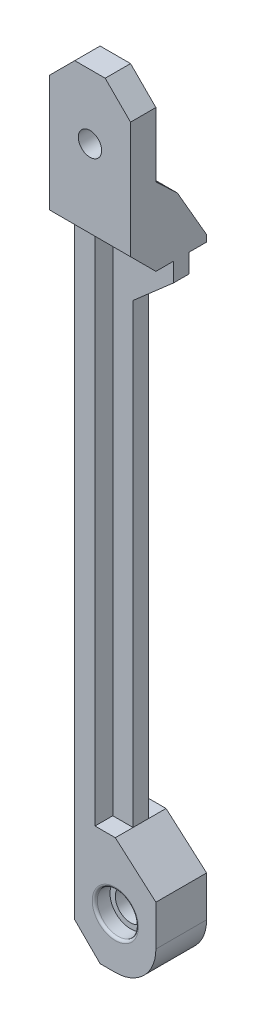
ISO-10303-21;
HEADER;
FILE_DESCRIPTION(('STEP AP214'),'2;1');
FILE_NAME('part.step','',(''),(''),'','','');
FILE_SCHEMA(('AUTOMOTIVE_DESIGN { 1 0 10303 214 1 1 1 1 }'));
ENDSEC;
DATA;
#1=APPLICATION_CONTEXT('core data for automotive mechanical design processes');
#2=APPLICATION_PROTOCOL_DEFINITION('international standard','automotive_design',2000,#1);
#3=PRODUCT_CONTEXT('',#1,'mechanical');
#4=PRODUCT('Part','Part','',(#3));
#5=PRODUCT_RELATED_PRODUCT_CATEGORY('part','',(#4));
#6=PRODUCT_DEFINITION_FORMATION('','',#4);
#7=PRODUCT_DEFINITION_CONTEXT('part definition',#1,'design');
#8=PRODUCT_DEFINITION('design','',#6,#7);
#9=PRODUCT_DEFINITION_SHAPE('','',#8);
#10=(LENGTH_UNIT() NAMED_UNIT(*) SI_UNIT(.MILLI.,.METRE.));
#11=(NAMED_UNIT(*) PLANE_ANGLE_UNIT() SI_UNIT($,.RADIAN.));
#12=(NAMED_UNIT(*) SI_UNIT($,.STERADIAN.) SOLID_ANGLE_UNIT());
#13=UNCERTAINTY_MEASURE_WITH_UNIT(LENGTH_MEASURE(1.E-05),#10,'distance_accuracy_value','');
#14=(GEOMETRIC_REPRESENTATION_CONTEXT(3) GLOBAL_UNCERTAINTY_ASSIGNED_CONTEXT((#13)) GLOBAL_UNIT_ASSIGNED_CONTEXT((#10,
#11,#12)) REPRESENTATION_CONTEXT('',''));
#15=CARTESIAN_POINT('',(0.,0.,0.));
#16=DIRECTION('',(0.,0.,1.));
#17=DIRECTION('',(1.,0.,0.));
#18=AXIS2_PLACEMENT_3D('',#15,#16,#17);
#19=CARTESIAN_POINT('',(0.,-67.5,10.));
#20=DIRECTION('',(0.,0.,-1.));
#21=DIRECTION('',(-1.,0.,0.));
#22=AXIS2_PLACEMENT_3D('',#19,#20,#21);
#23=CYLINDRICAL_SURFACE('',#22,4.05);
#24=CARTESIAN_POINT('',(0.,-67.5,0.5));
#25=DIRECTION('',(0.,0.,1.));
#26=DIRECTION('',(1.,0.,0.));
#27=AXIS2_PLACEMENT_3D('',#24,#25,#26);
#28=CIRCLE('',#27,4.05);
#29=CARTESIAN_POINT('',(4.05000000000002,-67.5,0.5));
#30=VERTEX_POINT('',#29);
#31=EDGE_CURVE('E11',#30,#30,#28,.F.);
#32=ORIENTED_EDGE('',*,*,#31,.T.);
#33=EDGE_LOOP('',(#32));
#34=FACE_BOUND('',#33,.T.);
#35=CARTESIAN_POINT('',(0.,-67.5,3.));
#36=DIRECTION('',(0.,0.,1.));
#37=DIRECTION('',(1.,0.,0.));
#38=AXIS2_PLACEMENT_3D('',#35,#36,#37);
#39=CIRCLE('',#38,4.05);
#40=CARTESIAN_POINT('',(4.05000000000002,-67.5,3.));
#41=VERTEX_POINT('',#40);
#42=EDGE_CURVE('E250',#41,#41,#39,.T.);
#43=ORIENTED_EDGE('',*,*,#42,.T.);
#44=EDGE_LOOP('',(#43));
#45=FACE_BOUND('',#44,.T.);
#46=ADVANCED_FACE('F37',(#34,#45),#23,.F.);
#47=CARTESIAN_POINT('',(0.,0.,10.));
#48=DIRECTION('',(0.,0.,1.));
#49=DIRECTION('',(1.,0.,0.));
#50=AXIS2_PLACEMENT_3D('',#47,#48,#49);
#51=PLANE('',#50);
#52=CARTESIAN_POINT('',(0.,-67.5,10.));
#53=DIRECTION('',(0.,0.,1.));
#54=DIRECTION('',(1.,0.,0.));
#55=AXIS2_PLACEMENT_3D('',#52,#53,#54);
#56=CIRCLE('',#55,4.55);
#57=CARTESIAN_POINT('',(4.55000000000002,-67.5,10.));
#58=VERTEX_POINT('',#57);
#59=EDGE_CURVE('E432',#58,#58,#56,.F.);
#60=ORIENTED_EDGE('',*,*,#59,.T.);
#61=EDGE_LOOP('',(#60));
#62=FACE_BOUND('',#61,.T.);
#63=DIRECTION('',(-0.752104997827,0.659043300734974,0.));
#64=VECTOR('',#63,1.);
#65=CARTESIAN_POINT('',(8.00000000000002,-61.5,10.));
#66=LINE('',#65,#64);
#67=CARTESIAN_POINT('',(8.00000000000002,-61.5,10.));
#68=VERTEX_POINT('',#67);
#69=CARTESIAN_POINT('',(0.,-54.4898798424252,10.));
#70=VERTEX_POINT('',#69);
#71=EDGE_CURVE('E338',#68,#70,#66,.T.);
#72=ORIENTED_EDGE('',*,*,#71,.T.);
#73=DIRECTION('',(-1.,0.,0.));
#74=VECTOR('',#73,1.);
#75=CARTESIAN_POINT('',(20.,-54.4898798424252,10.));
#76=LINE('',#75,#74);
#77=CARTESIAN_POINT('',(-3.99999999999999,-54.4898798424252,10.));
#78=VERTEX_POINT('',#77);
#79=EDGE_CURVE('E232',#70,#78,#76,.T.);
#80=ORIENTED_EDGE('',*,*,#79,.T.);
#81=DIRECTION('',(0.,-1.,0.));
#82=VECTOR('',#81,1.);
#83=CARTESIAN_POINT('',(-4.00000000000001,46.2196868799931,10.));
#84=LINE('',#83,#82);
#85=CARTESIAN_POINT('',(-4.00000000000001,46.2196868799931,10.));
#86=VERTEX_POINT('',#85);
#87=EDGE_CURVE('E246',#86,#78,#84,.T.);
#88=ORIENTED_EDGE('',*,*,#87,.F.);
#89=DIRECTION('',(-1.,0.,0.));
#90=VECTOR('',#89,1.);
#91=CARTESIAN_POINT('',(0.,46.2196868799931,10.));
#92=LINE('',#91,#90);
#93=CARTESIAN_POINT('',(-7.99999999999998,46.2196868799931,10.));
#94=VERTEX_POINT('',#93);
#95=EDGE_CURVE('E366',#86,#94,#92,.T.);
#96=ORIENTED_EDGE('',*,*,#95,.T.);
#97=DIRECTION('',(0.,-1.,0.));
#98=VECTOR('',#97,1.);
#99=CARTESIAN_POINT('',(-7.99999999999998,42.5,10.));
#100=LINE('',#99,#98);
#101=CARTESIAN_POINT('',(-7.99999999999998,-72.4999999999999,10.));
#102=VERTEX_POINT('',#101);
#103=EDGE_CURVE('E330',#94,#102,#100,.T.);
#104=ORIENTED_EDGE('',*,*,#103,.T.);
#105=DIRECTION('',(-0.707106781186547,0.707106781186549,0.));
#106=VECTOR('',#105,1.);
#107=CARTESIAN_POINT('',(-40.25,-40.2499999999999,10.));
#108=LINE('',#107,#106);
#109=CARTESIAN_POINT('',(-2.99999999999996,-77.5,10.));
#110=VERTEX_POINT('',#109);
#111=EDGE_CURVE('E410',#102,#110,#108,.F.);
#112=ORIENTED_EDGE('',*,*,#111,.T.);
#113=DIRECTION('',(1.,0.,0.));
#114=VECTOR('',#113,1.);
#115=CARTESIAN_POINT('',(-7.99999999999998,-77.5,10.));
#116=LINE('',#115,#114);
#117=CARTESIAN_POINT('',(0.,-77.5,10.));
#118=VERTEX_POINT('',#117);
#119=EDGE_CURVE('E333',#110,#118,#116,.T.);
#120=ORIENTED_EDGE('',*,*,#119,.T.);
#121=CARTESIAN_POINT('',(0.,-69.5,10.));
#122=DIRECTION('',(0.,0.,1.));
#123=DIRECTION('',(1.,0.,0.));
#124=AXIS2_PLACEMENT_3D('',#121,#122,#123);
#125=CIRCLE('',#124,8.);
#126=CARTESIAN_POINT('',(8.00000000000002,-69.5,10.));
#127=VERTEX_POINT('',#126);
#128=EDGE_CURVE('E418',#118,#127,#125,.T.);
#129=ORIENTED_EDGE('',*,*,#128,.T.);
#130=DIRECTION('',(0.,1.,0.));
#131=VECTOR('',#130,1.);
#132=CARTESIAN_POINT('',(8.00000000000002,-77.5,10.));
#133=LINE('',#132,#131);
#134=EDGE_CURVE('E336',#127,#68,#133,.T.);
#135=ORIENTED_EDGE('',*,*,#134,.T.);
#136=EDGE_LOOP('',(#72,#80,#88,#96,#104,#112,#120,#129,#135));
#137=FACE_BOUND('',#136,.T.);
#138=ADVANCED_FACE('F448',(#62,#137),#51,.T.);
#139=CARTESIAN_POINT('',(0.,0.,0.));
#140=DIRECTION('',(0.,0.,1.));
#141=DIRECTION('',(1.,0.,0.));
#142=AXIS2_PLACEMENT_3D('',#139,#140,#141);
#143=PLANE('',#142);
#144=CARTESIAN_POINT('',(0.,-67.5,0.));
#145=DIRECTION('',(0.,0.,1.));
#146=DIRECTION('',(1.,0.,0.));
#147=AXIS2_PLACEMENT_3D('',#144,#145,#146);
#148=CIRCLE('',#147,4.55);
#149=CARTESIAN_POINT('',(4.55000000000002,-67.5,0.));
#150=VERTEX_POINT('',#149);
#151=EDGE_CURVE('E45',#150,#150,#148,.T.);
#152=ORIENTED_EDGE('',*,*,#151,.T.);
#153=EDGE_LOOP('',(#152));
#154=FACE_BOUND('',#153,.T.);
#155=DIRECTION('',(-1.,0.,0.));
#156=VECTOR('',#155,1.);
#157=CARTESIAN_POINT('',(20.,46.2196868799931,0.));
#158=LINE('',#157,#156);
#159=CARTESIAN_POINT('',(7.99999999999999,46.2196868799931,0.));
#160=VERTEX_POINT('',#159);
#161=CARTESIAN_POINT('',(-4.00000000000001,46.2196868799931,0.));
#162=VERTEX_POINT('',#161);
#163=EDGE_CURVE('E218',#160,#162,#158,.T.);
#164=ORIENTED_EDGE('',*,*,#163,.T.);
#165=DIRECTION('',(0.,1.,0.));
#166=VECTOR('',#165,1.);
#167=CARTESIAN_POINT('',(-4.00000000000001,46.2196868799931,0.));
#168=LINE('',#167,#166);
#169=CARTESIAN_POINT('',(-3.99999999999999,-54.4898798424252,0.));
#170=VERTEX_POINT('',#169);
#171=EDGE_CURVE('E223',#170,#162,#168,.T.);
#172=ORIENTED_EDGE('',*,*,#171,.F.);
#173=DIRECTION('',(-1.,0.,0.));
#174=VECTOR('',#173,1.);
#175=CARTESIAN_POINT('',(20.,-54.4898798424252,0.));
#176=LINE('',#175,#174);
#177=CARTESIAN_POINT('',(0.,-54.4898798424252,0.));
#178=VERTEX_POINT('',#177);
#179=EDGE_CURVE('E493',#178,#170,#176,.T.);
#180=ORIENTED_EDGE('',*,*,#179,.F.);
#181=DIRECTION('',(-0.752104997827,0.659043300734974,0.));
#182=VECTOR('',#181,1.);
#183=CARTESIAN_POINT('',(8.00000000000002,-61.5,0.));
#184=LINE('',#183,#182);
#185=CARTESIAN_POINT('',(8.00000000000002,-61.5,0.));
#186=VERTEX_POINT('',#185);
#187=EDGE_CURVE('E348',#186,#178,#184,.T.);
#188=ORIENTED_EDGE('',*,*,#187,.F.);
#189=DIRECTION('',(0.,1.,0.));
#190=VECTOR('',#189,1.);
#191=CARTESIAN_POINT('',(8.00000000000002,-77.5,0.));
#192=LINE('',#191,#190);
#193=CARTESIAN_POINT('',(8.00000000000002,-69.5,0.));
#194=VERTEX_POINT('',#193);
#195=EDGE_CURVE('E346',#194,#186,#192,.T.);
#196=ORIENTED_EDGE('',*,*,#195,.F.);
#197=CARTESIAN_POINT('',(0.,-69.5,0.));
#198=DIRECTION('',(0.,0.,1.));
#199=DIRECTION('',(1.,0.,0.));
#200=AXIS2_PLACEMENT_3D('',#197,#198,#199);
#201=CIRCLE('',#200,8.);
#202=CARTESIAN_POINT('',(0.,-77.5,0.));
#203=VERTEX_POINT('',#202);
#204=EDGE_CURVE('E415',#194,#203,#201,.F.);
#205=ORIENTED_EDGE('',*,*,#204,.T.);
#206=DIRECTION('',(1.,0.,0.));
#207=VECTOR('',#206,1.);
#208=CARTESIAN_POINT('',(-7.99999999999998,-77.5,0.));
#209=LINE('',#208,#207);
#210=CARTESIAN_POINT('',(-2.99999999999996,-77.5,0.));
#211=VERTEX_POINT('',#210);
#212=EDGE_CURVE('E323',#211,#203,#209,.T.);
#213=ORIENTED_EDGE('',*,*,#212,.F.);
#214=DIRECTION('',(0.707106781186547,-0.707106781186549,0.));
#215=VECTOR('',#214,1.);
#216=CARTESIAN_POINT('',(-2.99999999999996,-77.5,0.));
#217=LINE('',#216,#215);
#218=CARTESIAN_POINT('',(-7.99999999999998,-72.5,0.));
#219=VERTEX_POINT('',#218);
#220=EDGE_CURVE('E406',#211,#219,#217,.F.);
#221=ORIENTED_EDGE('',*,*,#220,.T.);
#222=DIRECTION('',(0.,-1.,0.));
#223=VECTOR('',#222,1.);
#224=CARTESIAN_POINT('',(-7.99999999999998,42.5,0.));
#225=LINE('',#224,#223);
#226=CARTESIAN_POINT('',(-7.99999999999998,47.4999999999999,0.));
#227=VERTEX_POINT('',#226);
#228=EDGE_CURVE('E334',#227,#219,#225,.T.);
#229=ORIENTED_EDGE('',*,*,#228,.F.);
#230=DIRECTION('',(1.,0.,0.));
#231=VECTOR('',#230,1.);
#232=CARTESIAN_POINT('',(0.,47.4999999999999,0.));
#233=LINE('',#232,#231);
#234=CARTESIAN_POINT('',(7.99999999999999,47.4999999999999,0.));
#235=VERTEX_POINT('',#234);
#236=EDGE_CURVE('E381',#227,#235,#233,.T.);
#237=ORIENTED_EDGE('',*,*,#236,.T.);
#238=DIRECTION('',(0.,1.,0.));
#239=VECTOR('',#238,1.);
#240=CARTESIAN_POINT('',(7.99999999999999,42.5,0.));
#241=LINE('',#240,#239);
#242=EDGE_CURVE('E237',#160,#235,#241,.T.);
#243=ORIENTED_EDGE('',*,*,#242,.F.);
#244=EDGE_LOOP('',(#164,#172,#180,#188,#196,#205,#213,#221,#229,#237,#243));
#245=FACE_BOUND('',#244,.T.);
#246=ADVANCED_FACE('F235',(#154,#245),#143,.F.);
#247=CARTESIAN_POINT('',(0.,-54.4898798424252,10.));
#248=DIRECTION('',(-1.,0.,0.));
#249=DIRECTION('',(0.,-1.,0.));
#250=AXIS2_PLACEMENT_3D('',#247,#248,#249);
#251=PLANE('',#250);
#252=DIRECTION('',(0.,-1.,0.));
#253=VECTOR('',#252,1.);
#254=CARTESIAN_POINT('',(0.,-54.4898798424252,3.49999999999999));
#255=LINE('',#254,#253);
#256=CARTESIAN_POINT('',(0.,35.5101201575748,3.5));
#257=VERTEX_POINT('',#256);
#258=CARTESIAN_POINT('',(0.,-54.4898798424252,3.49999999999999));
#259=VERTEX_POINT('',#258);
#260=EDGE_CURVE('E270',#257,#259,#255,.T.);
#261=ORIENTED_EDGE('',*,*,#260,.F.);
#262=DIRECTION('',(0.,0.,-1.));
#263=VECTOR('',#262,1.);
#264=CARTESIAN_POINT('',(0.,35.5101201575748,10.));
#265=LINE('',#264,#263);
#266=CARTESIAN_POINT('',(0.,35.5101201575748,6.5));
#267=VERTEX_POINT('',#266);
#268=EDGE_CURVE('E356',#267,#257,#265,.T.);
#269=ORIENTED_EDGE('',*,*,#268,.F.);
#270=DIRECTION('',(0.,1.,0.));
#271=VECTOR('',#270,1.);
#272=CARTESIAN_POINT('',(0.,-54.4898798424252,6.49999999999999));
#273=LINE('',#272,#271);
#274=CARTESIAN_POINT('',(0.,-54.4898798424252,6.49999999999999));
#275=VERTEX_POINT('',#274);
#276=EDGE_CURVE('E266',#275,#267,#273,.T.);
#277=ORIENTED_EDGE('',*,*,#276,.F.);
#278=DIRECTION('',(0.,0.,-1.));
#279=VECTOR('',#278,1.);
#280=CARTESIAN_POINT('',(0.,-54.4898798424252,10.));
#281=LINE('',#280,#279);
#282=EDGE_CURVE('E363',#275,#259,#281,.T.);
#283=ORIENTED_EDGE('',*,*,#282,.T.);
#284=EDGE_LOOP('',(#261,#269,#277,#283));
#285=FACE_BOUND('',#284,.T.);
#286=ADVANCED_FACE('F564',(#285),#251,.F.);
#287=CARTESIAN_POINT('',(0.,35.5101201575748,10.));
#288=DIRECTION('',(-0.657964900909227,0.753048596819296,0.));
#289=DIRECTION('',(-0.753048596819297,-0.657964900909227,0.));
#290=AXIS2_PLACEMENT_3D('',#287,#288,#289);
#291=PLANE('',#290);
#292=DIRECTION('',(-0.753048596819297,-0.657964900909227,0.));
#293=VECTOR('',#292,1.);
#294=CARTESIAN_POINT('',(0.,35.5101201575748,3.5));
#295=LINE('',#294,#293);
#296=CARTESIAN_POINT('',(7.99999999999999,42.5,3.5));
#297=VERTEX_POINT('',#296);
#298=EDGE_CURVE('E268',#297,#257,#295,.T.);
#299=ORIENTED_EDGE('',*,*,#298,.F.);
#300=DIRECTION('',(0.,0.,-1.));
#301=VECTOR('',#300,1.);
#302=CARTESIAN_POINT('',(7.99999999999999,42.5,10.));
#303=LINE('',#302,#301);
#304=CARTESIAN_POINT('',(7.99999999999999,42.5,6.5));
#305=VERTEX_POINT('',#304);
#306=EDGE_CURVE('E344',#305,#297,#303,.T.);
#307=ORIENTED_EDGE('',*,*,#306,.F.);
#308=DIRECTION('',(0.753048596819297,0.657964900909227,0.));
#309=VECTOR('',#308,1.);
#310=CARTESIAN_POINT('',(0.,35.5101201575748,6.5));
#311=LINE('',#310,#309);
#312=EDGE_CURVE('E240',#267,#305,#311,.T.);
#313=ORIENTED_EDGE('',*,*,#312,.F.);
#314=ORIENTED_EDGE('',*,*,#268,.T.);
#315=EDGE_LOOP('',(#299,#307,#313,#314));
#316=FACE_BOUND('',#315,.T.);
#317=ADVANCED_FACE('F559',(#316),#291,.F.);
#318=CARTESIAN_POINT('',(7.99999999999999,42.5,10.));
#319=DIRECTION('',(-1.,0.,0.));
#320=DIRECTION('',(0.,-1.,0.));
#321=AXIS2_PLACEMENT_3D('',#318,#319,#320);
#322=PLANE('',#321);
#323=DIRECTION('',(0.,0.,1.));
#324=VECTOR('',#323,1.);
#325=CARTESIAN_POINT('',(7.99999999999999,46.2196868799931,10.));
#326=LINE('',#325,#324);
#327=CARTESIAN_POINT('',(7.99999999999999,46.2196868799931,3.5));
#328=VERTEX_POINT('',#327);
#329=EDGE_CURVE('E424',#160,#328,#326,.T.);
#330=ORIENTED_EDGE('',*,*,#329,.F.);
#331=ORIENTED_EDGE('',*,*,#242,.T.);
#332=DIRECTION('',(0.,-0.86602540378444,-0.499999999999998));
#333=VECTOR('',#332,1.);
#334=CARTESIAN_POINT('',(7.99999999999999,57.5,5.77350269189628));
#335=LINE('',#334,#333);
#336=CARTESIAN_POINT('',(7.99999999999999,57.5,5.77350269189628));
#337=VERTEX_POINT('',#336);
#338=EDGE_CURVE('E383',#235,#337,#335,.F.);
#339=ORIENTED_EDGE('',*,*,#338,.T.);
#340=DIRECTION('',(0.,0.687377771492314,0.72630007521565));
#341=VECTOR('',#340,1.);
#342=CARTESIAN_POINT('',(7.99999999999999,61.5,10.));
#343=LINE('',#342,#341);
#344=CARTESIAN_POINT('',(8.00000000000002,61.5,10.));
#345=VERTEX_POINT('',#344);
#346=EDGE_CURVE('E288',#337,#345,#343,.T.);
#347=ORIENTED_EDGE('',*,*,#346,.T.);
#348=DIRECTION('',(0.,1.,0.));
#349=VECTOR('',#348,1.);
#350=CARTESIAN_POINT('',(8.00000000000002,51.2196868799931,10.));
#351=LINE('',#350,#349);
#352=CARTESIAN_POINT('',(8.00000000000002,74.2038973689828,10.));
#353=VERTEX_POINT('',#352);
#354=EDGE_CURVE('E325',#345,#353,#351,.T.);
#355=ORIENTED_EDGE('',*,*,#354,.T.);
#356=DIRECTION('',(0.,0.,1.));
#357=VECTOR('',#356,1.);
#358=CARTESIAN_POINT('',(7.99999999999998,74.2038973689828,10.));
#359=LINE('',#358,#357);
#360=CARTESIAN_POINT('',(8.00000000000002,74.2038973689828,15.));
#361=VERTEX_POINT('',#360);
#362=EDGE_CURVE('E401',#353,#361,#359,.T.);
#363=ORIENTED_EDGE('',*,*,#362,.T.);
#364=DIRECTION('',(0.,1.,0.));
#365=VECTOR('',#364,1.);
#366=CARTESIAN_POINT('',(8.00000000000002,51.2196868799931,15.));
#367=LINE('',#366,#365);
#368=CARTESIAN_POINT('',(8.00000000000002,51.2196868799931,15.));
#369=VERTEX_POINT('',#368);
#370=EDGE_CURVE('E317',#369,#361,#367,.T.);
#371=ORIENTED_EDGE('',*,*,#370,.F.);
#372=DIRECTION('',(0.,-0.707106781186547,-0.707106781186548));
#373=VECTOR('',#372,1.);
#374=CARTESIAN_POINT('',(7.99999999999999,44.3598434399966,8.14015656000345));
#375=LINE('',#374,#373);
#376=CARTESIAN_POINT('',(7.99999999999999,46.2196868799931,10.));
#377=VERTEX_POINT('',#376);
#378=EDGE_CURVE('E369',#369,#377,#375,.T.);
#379=ORIENTED_EDGE('',*,*,#378,.T.);
#380=DIRECTION('',(0.,0.,1.));
#381=VECTOR('',#380,1.);
#382=CARTESIAN_POINT('',(7.99999999999999,46.2196868799931,10.));
#383=LINE('',#382,#381);
#384=CARTESIAN_POINT('',(7.99999999999999,46.2196868799931,6.5));
#385=VERTEX_POINT('',#384);
#386=EDGE_CURVE('E238',#385,#377,#383,.T.);
#387=ORIENTED_EDGE('',*,*,#386,.F.);
#388=DIRECTION('',(0.,1.,0.));
#389=VECTOR('',#388,1.);
#390=CARTESIAN_POINT('',(7.99999999999999,42.5,6.5));
#391=LINE('',#390,#389);
#392=EDGE_CURVE('E420',#305,#385,#391,.T.);
#393=ORIENTED_EDGE('',*,*,#392,.F.);
#394=ORIENTED_EDGE('',*,*,#306,.T.);
#395=DIRECTION('',(0.,-1.,0.));
#396=VECTOR('',#395,1.);
#397=CARTESIAN_POINT('',(7.99999999999999,42.5,3.5));
#398=LINE('',#397,#396);
#399=EDGE_CURVE('E422',#328,#297,#398,.T.);
#400=ORIENTED_EDGE('',*,*,#399,.F.);
#401=EDGE_LOOP('',(#330,#331,#339,#347,#355,#363,#371,#379,#387,#393,#394,#400));
#402=FACE_BOUND('',#401,.T.);
#403=ADVANCED_FACE('F553',(#402),#322,.F.);
#404=CARTESIAN_POINT('',(-7.99999999999998,57.5,10.));
#405=DIRECTION('',(0.,-1.,0.));
#406=DIRECTION('',(0.,0.,-1.));
#407=AXIS2_PLACEMENT_3D('',#404,#405,#406);
#408=PLANE('',#407);
#409=DIRECTION('',(0.,0.,-1.));
#410=VECTOR('',#409,1.);
#411=CARTESIAN_POINT('',(-4.99999999999999,57.5,5.77350269189628));
#412=LINE('',#411,#410);
#413=CARTESIAN_POINT('',(-4.99999999999999,57.5,10.));
#414=VERTEX_POINT('',#413);
#415=CARTESIAN_POINT('',(-4.99999999999999,57.5,5.77350269189628));
#416=VERTEX_POINT('',#415);
#417=EDGE_CURVE('E279',#414,#416,#412,.T.);
#418=ORIENTED_EDGE('',*,*,#417,.F.);
#419=DIRECTION('',(-1.,0.,0.));
#420=VECTOR('',#419,1.);
#421=CARTESIAN_POINT('',(-7.99999999999998,57.5,10.));
#422=LINE('',#421,#420);
#423=CARTESIAN_POINT('',(4.99999999999999,57.5,10.));
#424=VERTEX_POINT('',#423);
#425=EDGE_CURVE('E341',#424,#414,#422,.T.);
#426=ORIENTED_EDGE('',*,*,#425,.F.);
#427=DIRECTION('',(0.,0.,-1.));
#428=VECTOR('',#427,1.);
#429=CARTESIAN_POINT('',(4.99999999999999,57.5,5.77350269189628));
#430=LINE('',#429,#428);
#431=CARTESIAN_POINT('',(4.99999999999999,57.5,5.77350269189628));
#432=VERTEX_POINT('',#431);
#433=EDGE_CURVE('E293',#424,#432,#430,.T.);
#434=ORIENTED_EDGE('',*,*,#433,.T.);
#435=DIRECTION('',(-1.,0.,0.));
#436=VECTOR('',#435,1.);
#437=CARTESIAN_POINT('',(-7.99999999999998,57.5,5.77350269189628));
#438=LINE('',#437,#436);
#439=EDGE_CURVE('E375',#432,#416,#438,.T.);
#440=ORIENTED_EDGE('',*,*,#439,.T.);
#441=EDGE_LOOP('',(#418,#426,#434,#440));
#442=FACE_BOUND('',#441,.T.);
#443=ADVANCED_FACE('F539',(#442),#408,.F.);
#444=CARTESIAN_POINT('',(0.,0.,10.));
#445=DIRECTION('',(0.,0.,1.));
#446=DIRECTION('',(1.,0.,0.));
#447=AXIS2_PLACEMENT_3D('',#444,#445,#446);
#448=PLANE('',#447);
#449=CARTESIAN_POINT('',(0.,66.5,10.));
#450=DIRECTION('',(0.,0.,1.));
#451=DIRECTION('',(1.,0.,0.));
#452=AXIS2_PLACEMENT_3D('',#449,#450,#451);
#453=CIRCLE('',#452,2.3);
#454=CARTESIAN_POINT('',(2.3,66.5,10.));
#455=VERTEX_POINT('',#454);
#456=EDGE_CURVE('E305',#455,#455,#453,.T.);
#457=ORIENTED_EDGE('',*,*,#456,.T.);
#458=EDGE_LOOP('',(#457));
#459=FACE_BOUND('',#458,.T.);
#460=DIRECTION('',(0.,-1.,0.));
#461=VECTOR('',#460,1.);
#462=CARTESIAN_POINT('',(-7.99999999999998,79.2038973689827,10.));
#463=LINE('',#462,#461);
#464=CARTESIAN_POINT('',(-7.99999999999998,74.2038973689827,10.));
#465=VERTEX_POINT('',#464);
#466=CARTESIAN_POINT('',(-7.99999999999998,61.5,10.));
#467=VERTEX_POINT('',#466);
#468=EDGE_CURVE('E308',#465,#467,#463,.T.);
#469=ORIENTED_EDGE('',*,*,#468,.F.);
#470=DIRECTION('',(-0.707106781186549,-0.707106781186547,0.));
#471=VECTOR('',#470,1.);
#472=CARTESIAN_POINT('',(-7.99999999999998,74.2038973689827,10.));
#473=LINE('',#472,#471);
#474=CARTESIAN_POINT('',(-2.99999999999995,79.2038973689827,10.));
#475=VERTEX_POINT('',#474);
#476=EDGE_CURVE('E390',#465,#475,#473,.F.);
#477=ORIENTED_EDGE('',*,*,#476,.T.);
#478=DIRECTION('',(-1.,0.,0.));
#479=VECTOR('',#478,1.);
#480=CARTESIAN_POINT('',(8.00000000000002,79.2038973689827,10.));
#481=LINE('',#480,#479);
#482=CARTESIAN_POINT('',(3.00000000000001,79.2038973689827,10.));
#483=VERTEX_POINT('',#482);
#484=EDGE_CURVE('E314',#483,#475,#481,.T.);
#485=ORIENTED_EDGE('',*,*,#484,.F.);
#486=DIRECTION('',(-0.707106781186547,0.707106781186548,0.));
#487=VECTOR('',#486,1.);
#488=CARTESIAN_POINT('',(3.00000000000001,79.2038973689827,10.));
#489=LINE('',#488,#487);
#490=EDGE_CURVE('E388',#483,#353,#489,.F.);
#491=ORIENTED_EDGE('',*,*,#490,.T.);
#492=ORIENTED_EDGE('',*,*,#354,.F.);
#493=DIRECTION('',(1.,0.,0.));
#494=VECTOR('',#493,1.);
#495=CARTESIAN_POINT('',(4.99999999999999,61.5,10.));
#496=LINE('',#495,#494);
#497=CARTESIAN_POINT('',(4.99999999999999,61.5,10.));
#498=VERTEX_POINT('',#497);
#499=EDGE_CURVE('E299',#498,#345,#496,.T.);
#500=ORIENTED_EDGE('',*,*,#499,.F.);
#501=DIRECTION('',(0.,-1.,0.));
#502=VECTOR('',#501,1.);
#503=CARTESIAN_POINT('',(4.99999999999999,57.5,10.));
#504=LINE('',#503,#502);
#505=EDGE_CURVE('E291',#498,#424,#504,.T.);
#506=ORIENTED_EDGE('',*,*,#505,.T.);
#507=ORIENTED_EDGE('',*,*,#425,.T.);
#508=DIRECTION('',(0.,-1.,0.));
#509=VECTOR('',#508,1.);
#510=CARTESIAN_POINT('',(-4.99999999999999,57.5,10.));
#511=LINE('',#510,#509);
#512=CARTESIAN_POINT('',(-4.99999999999999,61.5,10.));
#513=VERTEX_POINT('',#512);
#514=EDGE_CURVE('E273',#513,#414,#511,.T.);
#515=ORIENTED_EDGE('',*,*,#514,.F.);
#516=DIRECTION('',(-1.,0.,0.));
#517=VECTOR('',#516,1.);
#518=CARTESIAN_POINT('',(-4.99999999999999,61.5,10.));
#519=LINE('',#518,#517);
#520=EDGE_CURVE('E282',#513,#467,#519,.T.);
#521=ORIENTED_EDGE('',*,*,#520,.T.);
#522=EDGE_LOOP('',(#469,#477,#485,#491,#492,#500,#506,#507,#515,#521));
#523=FACE_BOUND('',#522,.T.);
#524=ADVANCED_FACE('F543',(#459,#523),#448,.F.);
#525=CARTESIAN_POINT('',(-7.99999999999998,-77.5,10.));
#526=DIRECTION('',(0.,1.,0.));
#527=DIRECTION('',(0.,0.,1.));
#528=AXIS2_PLACEMENT_3D('',#525,#526,#527);
#529=PLANE('',#528);
#530=ORIENTED_EDGE('',*,*,#212,.T.);
#531=DIRECTION('',(0.,0.,-1.));
#532=VECTOR('',#531,1.);
#533=CARTESIAN_POINT('',(0.,-77.5,10.));
#534=LINE('',#533,#532);
#535=EDGE_CURVE('E60',#203,#118,#534,.F.);
#536=ORIENTED_EDGE('',*,*,#535,.T.);
#537=ORIENTED_EDGE('',*,*,#119,.F.);
#538=DIRECTION('',(0.,0.,-1.));
#539=VECTOR('',#538,1.);
#540=CARTESIAN_POINT('',(-2.99999999999996,-77.5,10.));
#541=LINE('',#540,#539);
#542=EDGE_CURVE('E403',#110,#211,#541,.T.);
#543=ORIENTED_EDGE('',*,*,#542,.T.);
#544=EDGE_LOOP('',(#530,#536,#537,#543));
#545=FACE_BOUND('',#544,.T.);
#546=ADVANCED_FACE('F514',(#545),#529,.F.);
#547=CARTESIAN_POINT('',(8.00000000000002,-77.5,10.));
#548=DIRECTION('',(-1.,0.,0.));
#549=DIRECTION('',(0.,0.,1.));
#550=AXIS2_PLACEMENT_3D('',#547,#548,#549);
#551=PLANE('',#550);
#552=ORIENTED_EDGE('',*,*,#134,.F.);
#553=DIRECTION('',(0.,0.,-1.));
#554=VECTOR('',#553,1.);
#555=CARTESIAN_POINT('',(8.00000000000002,-69.5,10.));
#556=LINE('',#555,#554);
#557=EDGE_CURVE('E412',#127,#194,#556,.T.);
#558=ORIENTED_EDGE('',*,*,#557,.T.);
#559=ORIENTED_EDGE('',*,*,#195,.T.);
#560=DIRECTION('',(0.,0.,-1.));
#561=VECTOR('',#560,1.);
#562=CARTESIAN_POINT('',(8.00000000000002,-61.5,10.));
#563=LINE('',#562,#561);
#564=EDGE_CURVE('E362',#68,#186,#563,.T.);
#565=ORIENTED_EDGE('',*,*,#564,.F.);
#566=EDGE_LOOP('',(#552,#558,#559,#565));
#567=FACE_BOUND('',#566,.T.);
#568=ADVANCED_FACE('F510',(#567),#551,.F.);
#569=CARTESIAN_POINT('',(8.00000000000002,-61.5,10.));
#570=DIRECTION('',(-0.659043300734974,-0.752104997827,0.));
#571=DIRECTION('',(0.752104997827,-0.659043300734974,0.));
#572=AXIS2_PLACEMENT_3D('',#569,#570,#571);
#573=PLANE('',#572);
#574=ORIENTED_EDGE('',*,*,#187,.T.);
#575=EDGE_CURVE('E359',#259,#178,#281,.T.);
#576=ORIENTED_EDGE('',*,*,#575,.F.);
#577=ORIENTED_EDGE('',*,*,#282,.F.);
#578=EDGE_CURVE('E360',#70,#275,#281,.T.);
#579=ORIENTED_EDGE('',*,*,#578,.F.);
#580=ORIENTED_EDGE('',*,*,#71,.F.);
#581=ORIENTED_EDGE('',*,*,#564,.T.);
#582=EDGE_LOOP('',(#574,#576,#577,#579,#580,#581));
#583=FACE_BOUND('',#582,.T.);
#584=ADVANCED_FACE('F469',(#583),#573,.F.);
#585=CARTESIAN_POINT('',(-7.99999999999998,42.5,10.));
#586=DIRECTION('',(1.,0.,0.));
#587=DIRECTION('',(0.,0.,-1.));
#588=AXIS2_PLACEMENT_3D('',#585,#586,#587);
#589=PLANE('',#588);
#590=ORIENTED_EDGE('',*,*,#228,.T.);
#591=DIRECTION('',(0.,0.,1.));
#592=VECTOR('',#591,1.);
#593=CARTESIAN_POINT('',(-7.99999999999998,-72.5,10.));
#594=LINE('',#593,#592);
#595=EDGE_CURVE('E408',#219,#102,#594,.T.);
#596=ORIENTED_EDGE('',*,*,#595,.T.);
#597=ORIENTED_EDGE('',*,*,#103,.F.);
#598=DIRECTION('',(0.,0.707106781186547,0.707106781186548));
#599=VECTOR('',#598,1.);
#600=CARTESIAN_POINT('',(-7.99999999999998,44.3598434399966,8.14015656000345));
#601=LINE('',#600,#599);
#602=CARTESIAN_POINT('',(-7.99999999999998,51.2196868799931,15.));
#603=VERTEX_POINT('',#602);
#604=EDGE_CURVE('E372',#94,#603,#601,.T.);
#605=ORIENTED_EDGE('',*,*,#604,.T.);
#606=DIRECTION('',(0.,-1.,0.));
#607=VECTOR('',#606,1.);
#608=CARTESIAN_POINT('',(-7.99999999999998,79.2038973689827,15.));
#609=LINE('',#608,#607);
#610=CARTESIAN_POINT('',(-7.99999999999998,74.2038973689827,15.));
#611=VERTEX_POINT('',#610);
#612=EDGE_CURVE('E311',#611,#603,#609,.T.);
#613=ORIENTED_EDGE('',*,*,#612,.F.);
#614=DIRECTION('',(0.,0.,-1.));
#615=VECTOR('',#614,1.);
#616=CARTESIAN_POINT('',(-7.99999999999998,74.2038973689827,10.));
#617=LINE('',#616,#615);
#618=EDGE_CURVE('E385',#611,#465,#617,.T.);
#619=ORIENTED_EDGE('',*,*,#618,.T.);
#620=ORIENTED_EDGE('',*,*,#468,.T.);
#621=DIRECTION('',(0.,0.687377771492314,0.72630007521565));
#622=VECTOR('',#621,1.);
#623=CARTESIAN_POINT('',(-7.99999999999999,61.5,10.));
#624=LINE('',#623,#622);
#625=CARTESIAN_POINT('',(-7.99999999999999,57.5,5.77350269189628));
#626=VERTEX_POINT('',#625);
#627=EDGE_CURVE('E272',#626,#467,#624,.T.);
#628=ORIENTED_EDGE('',*,*,#627,.F.);
#629=DIRECTION('',(0.,0.86602540378444,0.499999999999998));
#630=VECTOR('',#629,1.);
#631=CARTESIAN_POINT('',(-7.99999999999998,57.5,5.77350269189628));
#632=LINE('',#631,#630);
#633=EDGE_CURVE('E379',#626,#227,#632,.F.);
#634=ORIENTED_EDGE('',*,*,#633,.T.);
#635=EDGE_LOOP('',(#590,#596,#597,#605,#613,#619,#620,#628,#634));
#636=FACE_BOUND('',#635,.T.);
#637=ADVANCED_FACE('F461',(#636),#589,.F.);
#638=CARTESIAN_POINT('',(0.,-67.5,9.5));
#639=DIRECTION('',(0.,0.,1.));
#640=DIRECTION('',(1.,0.,0.));
#641=AXIS2_PLACEMENT_3D('',#638,#639,#640);
#642=CIRCLE('',#641,4.05);
#643=CARTESIAN_POINT('',(4.05000000000002,-67.5,9.5));
#644=VERTEX_POINT('',#643);
#645=EDGE_CURVE('E429',#644,#644,#642,.T.);
#646=ORIENTED_EDGE('',*,*,#645,.T.);
#647=EDGE_LOOP('',(#646));
#648=FACE_BOUND('',#647,.T.);
#649=CARTESIAN_POINT('',(0.,-67.5,7.));
#650=DIRECTION('',(0.,0.,1.));
#651=DIRECTION('',(1.,0.,0.));
#652=AXIS2_PLACEMENT_3D('',#649,#650,#651);
#653=CIRCLE('',#652,4.05);
#654=CARTESIAN_POINT('',(4.05000000000002,-67.5,7.));
#655=VERTEX_POINT('',#654);
#656=EDGE_CURVE('E426',#655,#655,#653,.T.);
#657=ORIENTED_EDGE('',*,*,#656,.F.);
#658=EDGE_LOOP('',(#657));
#659=FACE_BOUND('',#658,.T.);
#660=ADVANCED_FACE('F451',(#648,#659),#23,.F.);
#661=CARTESIAN_POINT('',(8.00000000000002,79.2038973689827,15.));
#662=DIRECTION('',(0.,-1.,0.));
#663=DIRECTION('',(0.,0.,-1.));
#664=AXIS2_PLACEMENT_3D('',#661,#662,#663);
#665=PLANE('',#664);
#666=ORIENTED_EDGE('',*,*,#484,.T.);
#667=DIRECTION('',(0.,0.,1.));
#668=VECTOR('',#667,1.);
#669=CARTESIAN_POINT('',(-2.99999999999995,79.2038973689827,15.));
#670=LINE('',#669,#668);
#671=CARTESIAN_POINT('',(-2.99999999999995,79.2038973689827,15.));
#672=VERTEX_POINT('',#671);
#673=EDGE_CURVE('E395',#475,#672,#670,.T.);
#674=ORIENTED_EDGE('',*,*,#673,.T.);
#675=DIRECTION('',(-1.,0.,0.));
#676=VECTOR('',#675,1.);
#677=CARTESIAN_POINT('',(8.00000000000002,79.2038973689827,15.));
#678=LINE('',#677,#676);
#679=CARTESIAN_POINT('',(3.00000000000001,79.2038973689827,15.));
#680=VERTEX_POINT('',#679);
#681=EDGE_CURVE('E320',#680,#672,#678,.T.);
#682=ORIENTED_EDGE('',*,*,#681,.F.);
#683=DIRECTION('',(0.,0.,-1.));
#684=VECTOR('',#683,1.);
#685=CARTESIAN_POINT('',(3.00000000000001,79.2038973689827,15.));
#686=LINE('',#685,#684);
#687=EDGE_CURVE('E392',#680,#483,#686,.T.);
#688=ORIENTED_EDGE('',*,*,#687,.T.);
#689=EDGE_LOOP('',(#666,#674,#682,#688));
#690=FACE_BOUND('',#689,.T.);
#691=ADVANCED_FACE('F460',(#690),#665,.F.);
#692=CARTESIAN_POINT('',(0.,0.,15.));
#693=DIRECTION('',(0.,0.,1.));
#694=DIRECTION('',(1.,0.,0.));
#695=AXIS2_PLACEMENT_3D('',#692,#693,#694);
#696=PLANE('',#695);
#697=CARTESIAN_POINT('',(0.,66.5,15.));
#698=DIRECTION('',(0.,0.,1.));
#699=DIRECTION('',(1.,0.,0.));
#700=AXIS2_PLACEMENT_3D('',#697,#698,#699);
#701=CIRCLE('',#700,2.3);
#702=CARTESIAN_POINT('',(2.3,66.5,15.));
#703=VERTEX_POINT('',#702);
#704=EDGE_CURVE('E304',#703,#703,#701,.T.);
#705=ORIENTED_EDGE('',*,*,#704,.F.);
#706=EDGE_LOOP('',(#705));
#707=FACE_BOUND('',#706,.T.);
#708=ORIENTED_EDGE('',*,*,#681,.T.);
#709=DIRECTION('',(0.707106781186549,0.707106781186547,0.));
#710=VECTOR('',#709,1.);
#711=CARTESIAN_POINT('',(-41.1019486844913,41.1019486844915,15.));
#712=LINE('',#711,#710);
#713=EDGE_CURVE('E399',#672,#611,#712,.F.);
#714=ORIENTED_EDGE('',*,*,#713,.T.);
#715=ORIENTED_EDGE('',*,*,#612,.T.);
#716=DIRECTION('',(1.,0.,0.));
#717=VECTOR('',#716,1.);
#718=CARTESIAN_POINT('',(-7.99999999999998,51.2196868799931,15.));
#719=LINE('',#718,#717);
#720=EDGE_CURVE('E313',#603,#369,#719,.T.);
#721=ORIENTED_EDGE('',*,*,#720,.T.);
#722=ORIENTED_EDGE('',*,*,#370,.T.);
#723=DIRECTION('',(0.707106781186547,-0.707106781186548,0.));
#724=VECTOR('',#723,1.);
#725=CARTESIAN_POINT('',(41.1019486844914,41.1019486844913,15.));
#726=LINE('',#725,#724);
#727=EDGE_CURVE('E397',#361,#680,#726,.F.);
#728=ORIENTED_EDGE('',*,*,#727,.T.);
#729=EDGE_LOOP('',(#708,#714,#715,#721,#722,#728));
#730=FACE_BOUND('',#729,.T.);
#731=ADVANCED_FACE('F467',(#707,#730),#696,.T.);
#732=CARTESIAN_POINT('',(0.,66.5,10.));
#733=DIRECTION('',(0.,0.,1.));
#734=DIRECTION('',(1.,0.,0.));
#735=AXIS2_PLACEMENT_3D('',#732,#733,#734);
#736=CYLINDRICAL_SURFACE('',#735,2.3);
#737=ORIENTED_EDGE('',*,*,#456,.F.);
#738=EDGE_LOOP('',(#737));
#739=FACE_BOUND('',#738,.T.);
#740=ORIENTED_EDGE('',*,*,#704,.T.);
#741=EDGE_LOOP('',(#740));
#742=FACE_BOUND('',#741,.T.);
#743=ADVANCED_FACE('F598',(#739,#742),#736,.F.);
#744=CARTESIAN_POINT('',(-7.99999999999998,51.2196868799931,15.));
#745=DIRECTION('',(0.,0.707106781186548,-0.707106781186547));
#746=DIRECTION('',(1.,0.,0.));
#747=AXIS2_PLACEMENT_3D('',#744,#745,#746);
#748=PLANE('',#747);
#749=ORIENTED_EDGE('',*,*,#604,.F.);
#750=ORIENTED_EDGE('',*,*,#95,.F.);
#751=EDGE_CURVE('E367',#377,#86,#92,.T.);
#752=ORIENTED_EDGE('',*,*,#751,.F.);
#753=ORIENTED_EDGE('',*,*,#378,.F.);
#754=ORIENTED_EDGE('',*,*,#720,.F.);
#755=EDGE_LOOP('',(#749,#750,#752,#753,#754));
#756=FACE_BOUND('',#755,.T.);
#757=ADVANCED_FACE('F580',(#756),#748,.F.);
#758=CARTESIAN_POINT('',(-7.99999999999998,57.5,5.77350269189628));
#759=DIRECTION('',(0.,-0.499999999999998,0.86602540378444));
#760=DIRECTION('',(-1.,0.,0.));
#761=AXIS2_PLACEMENT_3D('',#758,#759,#760);
#762=PLANE('',#761);
#763=ORIENTED_EDGE('',*,*,#338,.F.);
#764=ORIENTED_EDGE('',*,*,#236,.F.);
#765=ORIENTED_EDGE('',*,*,#633,.F.);
#766=DIRECTION('',(-1.,0.,0.));
#767=VECTOR('',#766,1.);
#768=CARTESIAN_POINT('',(-4.99999999999999,57.5,5.77350269189628));
#769=LINE('',#768,#767);
#770=EDGE_CURVE('E285',#416,#626,#769,.T.);
#771=ORIENTED_EDGE('',*,*,#770,.F.);
#772=ORIENTED_EDGE('',*,*,#439,.F.);
#773=EDGE_CURVE('E376',#337,#432,#438,.T.);
#774=ORIENTED_EDGE('',*,*,#773,.F.);
#775=EDGE_LOOP('',(#763,#764,#765,#771,#772,#774));
#776=FACE_BOUND('',#775,.T.);
#777=ADVANCED_FACE('F529',(#776),#762,.F.);
#778=CARTESIAN_POINT('',(4.99999999999999,61.5,10.));
#779=DIRECTION('',(0.,0.72630007521565,-0.687377771492315));
#780=DIRECTION('',(0.,0.687377771492315,0.72630007521565));
#781=AXIS2_PLACEMENT_3D('',#778,#779,#780);
#782=PLANE('',#781);
#783=ORIENTED_EDGE('',*,*,#346,.F.);
#784=ORIENTED_EDGE('',*,*,#773,.T.);
#785=DIRECTION('',(0.,0.687377771492314,0.72630007521565));
#786=VECTOR('',#785,1.);
#787=CARTESIAN_POINT('',(4.99999999999999,61.5,10.));
#788=LINE('',#787,#786);
#789=EDGE_CURVE('E296',#432,#498,#788,.T.);
#790=ORIENTED_EDGE('',*,*,#789,.T.);
#791=ORIENTED_EDGE('',*,*,#499,.T.);
#792=EDGE_LOOP('',(#783,#784,#790,#791));
#793=FACE_BOUND('',#792,.T.);
#794=ADVANCED_FACE('F550',(#793),#782,.T.);
#795=CARTESIAN_POINT('',(4.99999999999999,0.,0.));
#796=DIRECTION('',(1.,0.,0.));
#797=DIRECTION('',(0.,0.,-1.));
#798=AXIS2_PLACEMENT_3D('',#795,#796,#797);
#799=PLANE('',#798);
#800=ORIENTED_EDGE('',*,*,#505,.F.);
#801=ORIENTED_EDGE('',*,*,#789,.F.);
#802=ORIENTED_EDGE('',*,*,#433,.F.);
#803=EDGE_LOOP('',(#800,#801,#802));
#804=FACE_BOUND('',#803,.T.);
#805=ADVANCED_FACE('F547',(#804),#799,.F.);
#806=CARTESIAN_POINT('',(-4.99999999999999,61.5,10.));
#807=DIRECTION('',(0.,-0.72630007521565,0.687377771492315));
#808=DIRECTION('',(0.,-0.687377771492315,-0.72630007521565));
#809=AXIS2_PLACEMENT_3D('',#806,#807,#808);
#810=PLANE('',#809);
#811=ORIENTED_EDGE('',*,*,#627,.T.);
#812=ORIENTED_EDGE('',*,*,#520,.F.);
#813=DIRECTION('',(0.,0.687377771492314,0.72630007521565));
#814=VECTOR('',#813,1.);
#815=CARTESIAN_POINT('',(-4.99999999999999,61.5,10.));
#816=LINE('',#815,#814);
#817=EDGE_CURVE('E276',#416,#513,#816,.T.);
#818=ORIENTED_EDGE('',*,*,#817,.F.);
#819=ORIENTED_EDGE('',*,*,#770,.T.);
#820=EDGE_LOOP('',(#811,#812,#818,#819));
#821=FACE_BOUND('',#820,.T.);
#822=ADVANCED_FACE('F533',(#821),#810,.F.);
#823=CARTESIAN_POINT('',(-4.99999999999999,0.,0.));
#824=DIRECTION('',(-1.,0.,0.));
#825=DIRECTION('',(0.,0.,-1.));
#826=AXIS2_PLACEMENT_3D('',#823,#824,#825);
#827=PLANE('',#826);
#828=ORIENTED_EDGE('',*,*,#514,.T.);
#829=ORIENTED_EDGE('',*,*,#417,.T.);
#830=ORIENTED_EDGE('',*,*,#817,.T.);
#831=EDGE_LOOP('',(#828,#829,#830));
#832=FACE_BOUND('',#831,.T.);
#833=ADVANCED_FACE('F536',(#832),#827,.F.);
#834=CARTESIAN_POINT('',(-7.99999999999998,74.2038973689827,10.));
#835=DIRECTION('',(0.707106781186546,-0.707106781186548,0.));
#836=DIRECTION('',(0.,0.,-1.));
#837=AXIS2_PLACEMENT_3D('',#834,#835,#836);
#838=PLANE('',#837);
#839=ORIENTED_EDGE('',*,*,#713,.F.);
#840=ORIENTED_EDGE('',*,*,#673,.F.);
#841=ORIENTED_EDGE('',*,*,#476,.F.);
#842=ORIENTED_EDGE('',*,*,#618,.F.);
#843=EDGE_LOOP('',(#839,#840,#841,#842));
#844=FACE_BOUND('',#843,.T.);
#845=ADVANCED_FACE('F587',(#844),#838,.F.);
#846=CARTESIAN_POINT('',(3.00000000000001,79.2038973689827,15.));
#847=DIRECTION('',(-0.707106781186548,-0.707106781186547,0.));
#848=DIRECTION('',(0.,0.,-1.));
#849=AXIS2_PLACEMENT_3D('',#846,#847,#848);
#850=PLANE('',#849);
#851=ORIENTED_EDGE('',*,*,#727,.F.);
#852=ORIENTED_EDGE('',*,*,#362,.F.);
#853=ORIENTED_EDGE('',*,*,#490,.F.);
#854=ORIENTED_EDGE('',*,*,#687,.F.);
#855=EDGE_LOOP('',(#851,#852,#853,#854));
#856=FACE_BOUND('',#855,.T.);
#857=ADVANCED_FACE('F594',(#856),#850,.F.);
#858=CARTESIAN_POINT('',(-2.99999999999996,-77.5,10.));
#859=DIRECTION('',(0.707106781186548,0.707106781186546,0.));
#860=DIRECTION('',(0.,0.,-1.));
#861=AXIS2_PLACEMENT_3D('',#858,#859,#860);
#862=PLANE('',#861);
#863=ORIENTED_EDGE('',*,*,#111,.F.);
#864=ORIENTED_EDGE('',*,*,#595,.F.);
#865=ORIENTED_EDGE('',*,*,#220,.F.);
#866=ORIENTED_EDGE('',*,*,#542,.F.);
#867=EDGE_LOOP('',(#863,#864,#865,#866));
#868=FACE_BOUND('',#867,.T.);
#869=ADVANCED_FACE('F521',(#868),#862,.F.);
#870=CARTESIAN_POINT('',(0.,-69.5,10.));
#871=DIRECTION('',(0.,0.,-1.));
#872=DIRECTION('',(-1.,0.,0.));
#873=AXIS2_PLACEMENT_3D('',#870,#871,#872);
#874=CYLINDRICAL_SURFACE('',#873,8.);
#875=ORIENTED_EDGE('',*,*,#128,.F.);
#876=ORIENTED_EDGE('',*,*,#535,.F.);
#877=ORIENTED_EDGE('',*,*,#204,.F.);
#878=ORIENTED_EDGE('',*,*,#557,.F.);
#879=EDGE_LOOP('',(#875,#876,#877,#878));
#880=FACE_BOUND('',#879,.T.);
#881=ADVANCED_FACE('F517',(#880),#874,.T.);
#882=CARTESIAN_POINT('',(20.,-54.4898798424252,10.));
#883=DIRECTION('',(0.,1.,0.));
#884=DIRECTION('',(-1.,0.,0.));
#885=AXIS2_PLACEMENT_3D('',#882,#883,#884);
#886=PLANE('',#885);
#887=ORIENTED_EDGE('',*,*,#578,.T.);
#888=DIRECTION('',(-1.,0.,0.));
#889=VECTOR('',#888,1.);
#890=CARTESIAN_POINT('',(20.,-54.4898798424252,6.49999999999999));
#891=LINE('',#890,#889);
#892=CARTESIAN_POINT('',(-3.99999999999999,-54.4898798424252,6.49999999999999));
#893=VERTEX_POINT('',#892);
#894=EDGE_CURVE('E261',#275,#893,#891,.T.);
#895=ORIENTED_EDGE('',*,*,#894,.T.);
#896=DIRECTION('',(0.,0.,-1.));
#897=VECTOR('',#896,1.);
#898=CARTESIAN_POINT('',(-3.99999999999999,-54.4898798424252,10.));
#899=LINE('',#898,#897);
#900=EDGE_CURVE('E249',#78,#893,#899,.T.);
#901=ORIENTED_EDGE('',*,*,#900,.F.);
#902=ORIENTED_EDGE('',*,*,#79,.F.);
#903=EDGE_LOOP('',(#887,#895,#901,#902));
#904=FACE_BOUND('',#903,.T.);
#905=ADVANCED_FACE('F567',(#904),#886,.T.);
#906=CARTESIAN_POINT('',(20.,46.2196868799931,6.5));
#907=DIRECTION('',(0.,0.,1.));
#908=DIRECTION('',(0.,-1.,0.));
#909=AXIS2_PLACEMENT_3D('',#906,#907,#908);
#910=PLANE('',#909);
#911=ORIENTED_EDGE('',*,*,#276,.T.);
#912=ORIENTED_EDGE('',*,*,#312,.T.);
#913=ORIENTED_EDGE('',*,*,#392,.T.);
#914=DIRECTION('',(-1.,0.,0.));
#915=VECTOR('',#914,1.);
#916=CARTESIAN_POINT('',(20.,46.2196868799931,6.5));
#917=LINE('',#916,#915);
#918=CARTESIAN_POINT('',(-4.00000000000001,46.2196868799931,6.5));
#919=VERTEX_POINT('',#918);
#920=EDGE_CURVE('E259',#385,#919,#917,.T.);
#921=ORIENTED_EDGE('',*,*,#920,.T.);
#922=DIRECTION('',(0.,1.,0.));
#923=VECTOR('',#922,1.);
#924=CARTESIAN_POINT('',(-4.00000000000001,46.2196868799931,6.5));
#925=LINE('',#924,#923);
#926=EDGE_CURVE('E253',#893,#919,#925,.T.);
#927=ORIENTED_EDGE('',*,*,#926,.F.);
#928=ORIENTED_EDGE('',*,*,#894,.F.);
#929=EDGE_LOOP('',(#911,#912,#913,#921,#927,#928));
#930=FACE_BOUND('',#929,.T.);
#931=ADVANCED_FACE('F570',(#930),#910,.T.);
#932=CARTESIAN_POINT('',(20.,46.2196868799931,10.));
#933=DIRECTION('',(0.,-1.,0.));
#934=DIRECTION('',(1.,0.,0.));
#935=AXIS2_PLACEMENT_3D('',#932,#933,#934);
#936=PLANE('',#935);
#937=ORIENTED_EDGE('',*,*,#386,.T.);
#938=ORIENTED_EDGE('',*,*,#751,.T.);
#939=DIRECTION('',(0.,0.,1.));
#940=VECTOR('',#939,1.);
#941=CARTESIAN_POINT('',(-4.00000000000001,46.2196868799931,10.));
#942=LINE('',#941,#940);
#943=EDGE_CURVE('E256',#919,#86,#942,.T.);
#944=ORIENTED_EDGE('',*,*,#943,.F.);
#945=ORIENTED_EDGE('',*,*,#920,.F.);
#946=EDGE_LOOP('',(#937,#938,#944,#945));
#947=FACE_BOUND('',#946,.T.);
#948=ADVANCED_FACE('F666',(#947),#936,.T.);
#949=CARTESIAN_POINT('',(-4.,0.,0.));
#950=DIRECTION('',(1.,0.,0.));
#951=DIRECTION('',(0.,1.,0.));
#952=AXIS2_PLACEMENT_3D('',#949,#950,#951);
#953=PLANE('',#952);
#954=ORIENTED_EDGE('',*,*,#87,.T.);
#955=ORIENTED_EDGE('',*,*,#900,.T.);
#956=ORIENTED_EDGE('',*,*,#926,.T.);
#957=ORIENTED_EDGE('',*,*,#943,.T.);
#958=EDGE_LOOP('',(#954,#955,#956,#957));
#959=FACE_BOUND('',#958,.T.);
#960=ADVANCED_FACE('F574',(#959),#953,.T.);
#961=CARTESIAN_POINT('',(20.,-54.4898798424252,0.));
#962=DIRECTION('',(0.,1.,0.));
#963=DIRECTION('',(-1.,0.,0.));
#964=AXIS2_PLACEMENT_3D('',#961,#962,#963);
#965=PLANE('',#964);
#966=ORIENTED_EDGE('',*,*,#575,.T.);
#967=ORIENTED_EDGE('',*,*,#179,.T.);
#968=DIRECTION('',(0.,0.,-1.));
#969=VECTOR('',#968,1.);
#970=CARTESIAN_POINT('',(-3.99999999999999,-54.4898798424252,0.));
#971=LINE('',#970,#969);
#972=CARTESIAN_POINT('',(-3.99999999999999,-54.4898798424252,3.49999999999999));
#973=VERTEX_POINT('',#972);
#974=EDGE_CURVE('E229',#973,#170,#971,.T.);
#975=ORIENTED_EDGE('',*,*,#974,.F.);
#976=DIRECTION('',(-1.,0.,0.));
#977=VECTOR('',#976,1.);
#978=CARTESIAN_POINT('',(20.,-54.4898798424252,3.49999999999999));
#979=LINE('',#978,#977);
#980=EDGE_CURVE('E242',#259,#973,#979,.T.);
#981=ORIENTED_EDGE('',*,*,#980,.F.);
#982=EDGE_LOOP('',(#966,#967,#975,#981));
#983=FACE_BOUND('',#982,.T.);
#984=ADVANCED_FACE('F499',(#983),#965,.T.);
#985=CARTESIAN_POINT('',(20.,46.2196868799931,0.));
#986=DIRECTION('',(0.,-1.,0.));
#987=DIRECTION('',(1.,0.,0.));
#988=AXIS2_PLACEMENT_3D('',#985,#986,#987);
#989=PLANE('',#988);
#990=ORIENTED_EDGE('',*,*,#329,.T.);
#991=DIRECTION('',(-1.,0.,0.));
#992=VECTOR('',#991,1.);
#993=CARTESIAN_POINT('',(20.,46.2196868799931,3.5));
#994=LINE('',#993,#992);
#995=CARTESIAN_POINT('',(-4.00000000000001,46.2196868799931,3.5));
#996=VERTEX_POINT('',#995);
#997=EDGE_CURVE('E52',#328,#996,#994,.T.);
#998=ORIENTED_EDGE('',*,*,#997,.T.);
#999=DIRECTION('',(0.,0.,1.));
#1000=VECTOR('',#999,1.);
#1001=CARTESIAN_POINT('',(-4.00000000000001,46.2196868799931,0.));
#1002=LINE('',#1001,#1000);
#1003=EDGE_CURVE('E214',#162,#996,#1002,.T.);
#1004=ORIENTED_EDGE('',*,*,#1003,.F.);
#1005=ORIENTED_EDGE('',*,*,#163,.F.);
#1006=EDGE_LOOP('',(#990,#998,#1004,#1005));
#1007=FACE_BOUND('',#1006,.T.);
#1008=ADVANCED_FACE('F216',(#1007),#989,.T.);
#1009=CARTESIAN_POINT('',(20.,46.2196868799931,3.5));
#1010=DIRECTION('',(0.,0.,-1.));
#1011=DIRECTION('',(0.,1.,0.));
#1012=AXIS2_PLACEMENT_3D('',#1009,#1010,#1011);
#1013=PLANE('',#1012);
#1014=ORIENTED_EDGE('',*,*,#260,.T.);
#1015=ORIENTED_EDGE('',*,*,#980,.T.);
#1016=DIRECTION('',(0.,-1.,0.));
#1017=VECTOR('',#1016,1.);
#1018=CARTESIAN_POINT('',(-4.00000000000001,46.2196868799931,3.5));
#1019=LINE('',#1018,#1017);
#1020=EDGE_CURVE('E222',#996,#973,#1019,.T.);
#1021=ORIENTED_EDGE('',*,*,#1020,.F.);
#1022=ORIENTED_EDGE('',*,*,#997,.F.);
#1023=ORIENTED_EDGE('',*,*,#399,.T.);
#1024=ORIENTED_EDGE('',*,*,#298,.T.);
#1025=EDGE_LOOP('',(#1014,#1015,#1021,#1022,#1023,#1024));
#1026=FACE_BOUND('',#1025,.T.);
#1027=ADVANCED_FACE('F495',(#1026),#1013,.T.);
#1028=CARTESIAN_POINT('',(-4.,0.,0.));
#1029=DIRECTION('',(-1.,0.,0.));
#1030=DIRECTION('',(0.,-1.,0.));
#1031=AXIS2_PLACEMENT_3D('',#1028,#1029,#1030);
#1032=PLANE('',#1031);
#1033=ORIENTED_EDGE('',*,*,#171,.T.);
#1034=ORIENTED_EDGE('',*,*,#1003,.T.);
#1035=ORIENTED_EDGE('',*,*,#1020,.T.);
#1036=ORIENTED_EDGE('',*,*,#974,.T.);
#1037=EDGE_LOOP('',(#1033,#1034,#1035,#1036));
#1038=FACE_BOUND('',#1037,.T.);
#1039=ADVANCED_FACE('F227',(#1038),#1032,.F.);
#1040=CARTESIAN_POINT('',(0.,-67.5,3.));
#1041=DIRECTION('',(0.,0.,1.));
#1042=DIRECTION('',(1.,0.,0.));
#1043=AXIS2_PLACEMENT_3D('',#1040,#1041,#1042);
#1044=PLANE('',#1043);
#1045=CARTESIAN_POINT('',(0.,-67.5,3.));
#1046=DIRECTION('',(0.,0.,1.));
#1047=DIRECTION('',(1.,0.,0.));
#1048=AXIS2_PLACEMENT_3D('',#1045,#1046,#1047);
#1049=CIRCLE('',#1048,3.);
#1050=CARTESIAN_POINT('',(3.00000000000002,-67.5,3.));
#1051=VERTEX_POINT('',#1050);
#1052=EDGE_CURVE('E484',#1051,#1051,#1049,.T.);
#1053=ORIENTED_EDGE('',*,*,#1052,.T.);
#1054=EDGE_LOOP('',(#1053));
#1055=FACE_BOUND('',#1054,.T.);
#1056=ORIENTED_EDGE('',*,*,#42,.F.);
#1057=EDGE_LOOP('',(#1056));
#1058=FACE_BOUND('',#1057,.T.);
#1059=ADVANCED_FACE('F821',(#1055,#1058),#1044,.F.);
#1060=CARTESIAN_POINT('',(0.,-67.5,3.));
#1061=DIRECTION('',(0.,0.,1.));
#1062=DIRECTION('',(1.,0.,0.));
#1063=AXIS2_PLACEMENT_3D('',#1060,#1061,#1062);
#1064=CYLINDRICAL_SURFACE('',#1063,3.);
#1065=ORIENTED_EDGE('',*,*,#1052,.F.);
#1066=EDGE_LOOP('',(#1065));
#1067=FACE_BOUND('',#1066,.T.);
#1068=CARTESIAN_POINT('',(0.,-67.5,7.));
#1069=DIRECTION('',(0.,0.,1.));
#1070=DIRECTION('',(1.,0.,0.));
#1071=AXIS2_PLACEMENT_3D('',#1068,#1069,#1070);
#1072=CIRCLE('',#1071,3.);
#1073=CARTESIAN_POINT('',(3.00000000000002,-67.5,7.));
#1074=VERTEX_POINT('',#1073);
#1075=EDGE_CURVE('E482',#1074,#1074,#1072,.T.);
#1076=ORIENTED_EDGE('',*,*,#1075,.T.);
#1077=EDGE_LOOP('',(#1076));
#1078=FACE_BOUND('',#1077,.T.);
#1079=ADVANCED_FACE('F478',(#1067,#1078),#1064,.F.);
#1080=CARTESIAN_POINT('',(0.,-67.5,7.));
#1081=DIRECTION('',(0.,0.,1.));
#1082=DIRECTION('',(1.,0.,0.));
#1083=AXIS2_PLACEMENT_3D('',#1080,#1081,#1082);
#1084=PLANE('',#1083);
#1085=ORIENTED_EDGE('',*,*,#656,.T.);
#1086=EDGE_LOOP('',(#1085));
#1087=FACE_BOUND('',#1086,.T.);
#1088=ORIENTED_EDGE('',*,*,#1075,.F.);
#1089=EDGE_LOOP('',(#1088));
#1090=FACE_BOUND('',#1089,.T.);
#1091=ADVANCED_FACE('F444',(#1087,#1090),#1084,.T.);
#1092=CARTESIAN_POINT('',(0.,-67.5,9.5));
#1093=DIRECTION('',(0.,0.,1.));
#1094=DIRECTION('',(1.,0.,0.));
#1095=AXIS2_PLACEMENT_3D('',#1092,#1093,#1094);
#1096=TOROIDAL_SURFACE('',#1095,4.55,0.5);
#1097=ORIENTED_EDGE('',*,*,#59,.F.);
#1098=EDGE_LOOP('',(#1097));
#1099=FACE_BOUND('',#1098,.T.);
#1100=ORIENTED_EDGE('',*,*,#645,.F.);
#1101=EDGE_LOOP('',(#1100));
#1102=FACE_BOUND('',#1101,.T.);
#1103=ADVANCED_FACE('F439',(#1099,#1102),#1096,.T.);
#1104=CARTESIAN_POINT('',(0.,-67.5,0.5));
#1105=DIRECTION('',(0.,0.,1.));
#1106=DIRECTION('',(1.,0.,0.));
#1107=AXIS2_PLACEMENT_3D('',#1104,#1105,#1106);
#1108=TOROIDAL_SURFACE('',#1107,4.55,0.5);
#1109=ORIENTED_EDGE('',*,*,#31,.F.);
#1110=EDGE_LOOP('',(#1109));
#1111=FACE_BOUND('',#1110,.T.);
#1112=ORIENTED_EDGE('',*,*,#151,.F.);
#1113=EDGE_LOOP('',(#1112));
#1114=FACE_BOUND('',#1113,.T.);
#1115=ADVANCED_FACE('F39',(#1111,#1114),#1108,.T.);
#1116=CLOSED_SHELL('',(#46,#138,#246,#286,#317,#403,#443,#524,#546,#568,#584,#637,#660,#691,
#731,#743,#757,#777,#794,#805,#822,#833,#845,#857,#869,#881,#905,#931,#948,#960,#984,#1008,
#1027,#1039,#1059,#1079,#1091,#1103,#1115));
#1117=MANIFOLD_SOLID_BREP('B2',#1116);
#1118=ADVANCED_BREP_SHAPE_REPRESENTATION('',(#18,#1117),#14);
#1119=SHAPE_DEFINITION_REPRESENTATION(#9,#1118);
ENDSEC;
END-ISO-10303-21;
